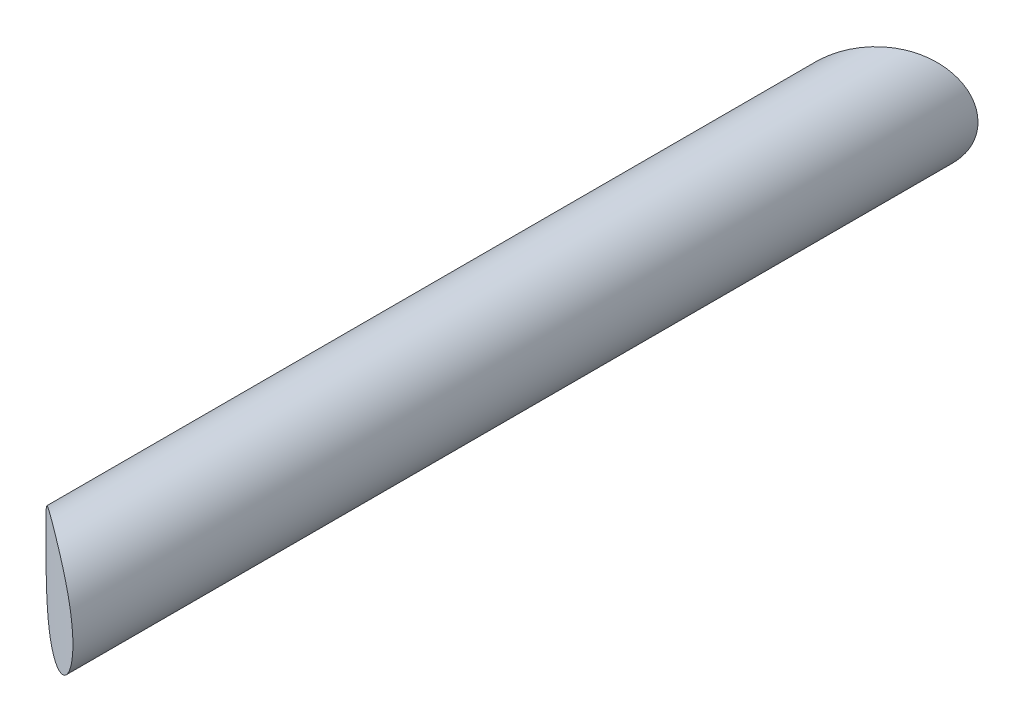
ISO-10303-21;
HEADER;
FILE_DESCRIPTION(('STEP AP214'),'2;1');
FILE_NAME('part.step','',(''),(''),'','','');
FILE_SCHEMA(('AUTOMOTIVE_DESIGN { 1 0 10303 214 1 1 1 1 }'));
ENDSEC;
DATA;
#1=APPLICATION_CONTEXT('core data for automotive mechanical design processes');
#2=APPLICATION_PROTOCOL_DEFINITION('international standard','automotive_design',2000,#1);
#3=PRODUCT_CONTEXT('',#1,'mechanical');
#4=PRODUCT('Part','Part','',(#3));
#5=PRODUCT_RELATED_PRODUCT_CATEGORY('part','',(#4));
#6=PRODUCT_DEFINITION_FORMATION('','',#4);
#7=PRODUCT_DEFINITION_CONTEXT('part definition',#1,'design');
#8=PRODUCT_DEFINITION('design','',#6,#7);
#9=PRODUCT_DEFINITION_SHAPE('','',#8);
#10=(LENGTH_UNIT() NAMED_UNIT(*) SI_UNIT(.MILLI.,.METRE.));
#11=(NAMED_UNIT(*) PLANE_ANGLE_UNIT() SI_UNIT($,.RADIAN.));
#12=(NAMED_UNIT(*) SI_UNIT($,.STERADIAN.) SOLID_ANGLE_UNIT());
#13=UNCERTAINTY_MEASURE_WITH_UNIT(LENGTH_MEASURE(1.E-05),#10,'distance_accuracy_value','');
#14=(GEOMETRIC_REPRESENTATION_CONTEXT(3) GLOBAL_UNCERTAINTY_ASSIGNED_CONTEXT((#13)) GLOBAL_UNIT_ASSIGNED_CONTEXT((#10,
#11,#12)) REPRESENTATION_CONTEXT('',''));
#15=CARTESIAN_POINT('',(0.,0.,0.));
#16=DIRECTION('',(0.,0.,1.));
#17=DIRECTION('',(1.,0.,0.));
#18=AXIS2_PLACEMENT_3D('',#15,#16,#17);
#19=CARTESIAN_POINT('',(0.,0.,-12.7));
#20=DIRECTION('',(0.,0.,1.));
#21=DIRECTION('',(1.,0.,0.));
#22=AXIS2_PLACEMENT_3D('',#19,#20,#21);
#23=CYLINDRICAL_SURFACE('',#22,1.35);
#24=CARTESIAN_POINT('',(1.35,0.,-11.0587056584394));
#25=CARTESIAN_POINT('',(1.35000202974968,0.0683117236619018,-11.0587065779387));
#26=CARTESIAN_POINT('',(1.34479351187721,0.136611916381151,-11.0557704538198));
#27=CARTESIAN_POINT('',(1.32423800582184,0.271151198424478,-11.0441250481397));
#28=CARTESIAN_POINT('',(1.30889193721564,0.337390474123632,-11.0354162902136));
#29=CARTESIAN_POINT('',(1.26887305416025,0.465807919673311,-11.0125248166408));
#30=CARTESIAN_POINT('',(1.2442201419215,0.527994425726224,-10.9983537804472));
#31=CARTESIAN_POINT('',(1.18671983462305,0.646965501902899,-10.9649520085586));
#32=CARTESIAN_POINT('',(1.15387103663791,0.703749144894012,-10.9457204065937));
#33=CARTESIAN_POINT('',(1.07981528175567,0.813041113820874,-10.9018118976244));
#34=CARTESIAN_POINT('',(1.03831785403161,0.865273929357036,-10.8769420083258));
#35=CARTESIAN_POINT('',(0.949478729441834,0.961927413155837,-10.822895498804));
#36=CARTESIAN_POINT('',(0.902135170596338,1.00634558149197,-10.7937175058774));
#37=CARTESIAN_POINT('',(0.797217839932821,1.09180999863554,-10.727994188568));
#38=CARTESIAN_POINT('',(0.73909711265127,1.13182587930861,-10.6909853381457));
#39=CARTESIAN_POINT('',(0.619315670367079,1.20156536931715,-10.6132237523081));
#40=CARTESIAN_POINT('',(0.557652999206522,1.23128322625432,-10.572468940456));
#41=CARTESIAN_POINT('',(0.422533231714895,1.28453596040605,-10.4813683292592));
#42=CARTESIAN_POINT('',(0.348744059015755,1.30636815783677,-10.4305211938372));
#43=CARTESIAN_POINT('',(0.200529493586344,1.33717086635505,-10.3259851026198));
#44=CARTESIAN_POINT('',(0.126103816070559,1.34613528074164,-10.2722948122326));
#45=CARTESIAN_POINT('',(-0.0341617961062906,1.35232686171306,-10.1539879776921));
#46=CARTESIAN_POINT('',(-0.119843219224185,1.34735596340079,-10.089038413138));
#47=CARTESIAN_POINT('',(-0.288120382624845,1.32164492162247,-9.95811818440156));
#48=CARTESIAN_POINT('',(-0.370711999892173,1.3008844445686,-9.89214631110862));
#49=CARTESIAN_POINT('',(-0.540314812679968,1.24079377524673,-9.75328154747184));
#50=CARTESIAN_POINT('',(-0.626737270590656,1.19959817122803,-9.68046788958517));
#51=CARTESIAN_POINT('',(-0.791043848241983,1.09820441500569,-9.53848573041724));
#52=CARTESIAN_POINT('',(-0.868939221487246,1.03803172497848,-9.4693124889473));
#53=CARTESIAN_POINT('',(-0.9892949327332,0.921060641752164,-9.36007827734508));
#54=CARTESIAN_POINT('',(-1.03501659403485,0.869585302258143,-9.31789074508389));
#55=CARTESIAN_POINT('',(-1.11955350970958,0.757629408845708,-9.23887725641851));
#56=CARTESIAN_POINT('',(-1.15838082356377,0.697164925977331,-9.20204195890079));
#57=CARTESIAN_POINT('',(-1.21973207950992,0.581439052975822,-9.14324667110279));
#58=CARTESIAN_POINT('',(-1.24396648462285,0.527852330382816,-9.11979112567716));
#59=CARTESIAN_POINT('',(-1.28573515339713,0.415868832822171,-9.07912435687196));
#60=CARTESIAN_POINT('',(-1.30327391728717,0.357475320762524,-9.06190893981449));
#61=CARTESIAN_POINT('',(-1.33055625841954,0.236611189042552,-9.03504095639409));
#62=CARTESIAN_POINT('',(-1.34023189508553,0.174109975172009,-9.02545432021547));
#63=CARTESIAN_POINT('',(-1.35064545768551,0.0476536076261703,-9.01513419147413));
#64=CARTESIAN_POINT('',(-1.35139020815257,-0.0163003984501001,-9.01439393895243));
#65=CARTESIAN_POINT('',(-1.34440461260654,-0.134564032412765,-9.02131962458989));
#66=CARTESIAN_POINT('',(-1.33780053679386,-0.189014029114349,-9.02786847772074));
#67=CARTESIAN_POINT('',(-1.31834230832775,-0.295656154426165,-9.04707934365985));
#68=CARTESIAN_POINT('',(-1.30548677186609,-0.347847780342071,-9.05974270995759));
#69=CARTESIAN_POINT('',(-1.27377523494469,-0.450532193950823,-9.09078780694729));
#70=CARTESIAN_POINT('',(-1.25474001304511,-0.500916813525263,-9.10933990935709));
#71=CARTESIAN_POINT('',(-1.21172222465393,-0.597520274019482,-9.15093366339153));
#72=CARTESIAN_POINT('',(-1.18773693743643,-0.643736803854421,-9.1739777835954));
#73=CARTESIAN_POINT('',(-1.12121720825725,-0.756095458595459,-9.23729536616992));
#74=CARTESIAN_POINT('',(-1.07576058528963,-0.819120720685797,-9.28004895010062));
#75=CARTESIAN_POINT('',(-0.977302562202648,-0.934427630317342,-9.37107331374112));
#76=CARTESIAN_POINT('',(-0.924282261136075,-0.986681536352163,-9.41935785338728));
#77=CARTESIAN_POINT('',(-0.796275732620925,-1.09421332853474,-9.53375629095417));
#78=CARTESIAN_POINT('',(-0.719366681746646,-1.14601018878245,-9.60099356151529));
#79=CARTESIAN_POINT('',(-0.558542836031548,-1.23242359559692,-9.73793878102672));
#80=CARTESIAN_POINT('',(-0.474625969414543,-1.26703504034752,-9.80764745708819));
#81=CARTESIAN_POINT('',(-0.300942495409437,-1.31917728912113,-9.9480142338071));
#82=CARTESIAN_POINT('',(-0.211126667258016,-1.3365375785827,-10.0186749486856));
#83=CARTESIAN_POINT('',(-0.028479432839006,-1.35280972420762,-10.158340249903));
#84=CARTESIAN_POINT('',(0.0643531481453871,-1.35171430572271,-10.2273441724549));
#85=CARTESIAN_POINT('',(0.253509828520963,-1.32951170322233,-10.3639974239162));
#86=CARTESIAN_POINT('',(0.349847500459695,-1.30774117132563,-10.4315256723982));
#87=CARTESIAN_POINT('',(0.538937266004975,-1.2417807105294,-10.5603328550335));
#88=CARTESIAN_POINT('',(0.631696729671833,-1.19763984000246,-10.6216251130946));
#89=CARTESIAN_POINT('',(0.781042363962177,-1.10348984983727,-10.717777924605));
#90=CARTESIAN_POINT('',(0.839956482080575,-1.05949739170587,-10.7549575056121));
#91=CARTESIAN_POINT('',(0.951412500569517,-0.960650420042957,-10.8241556376517));
#92=CARTESIAN_POINT('',(1.00395797076527,-0.905802037420443,-10.856177083323));
#93=CARTESIAN_POINT('',(1.10059756036541,-0.785601598132161,-10.9142634140535));
#94=CARTESIAN_POINT('',(1.14463316648362,-0.720182130266167,-10.9402872802089));
#95=CARTESIAN_POINT('',(1.22130186272802,-0.580721961495862,-10.9851289199883));
#96=CARTESIAN_POINT('',(1.25394188366599,-0.506686537494161,-11.0039510743748));
#97=CARTESIAN_POINT('',(1.30276523371941,-0.361260144970632,-11.0319317956116));
#98=CARTESIAN_POINT('',(1.32039165626157,-0.290516126715435,-11.0419421672441));
#99=CARTESIAN_POINT('',(1.34400484033384,-0.146509407994222,-11.055326832099));
#100=CARTESIAN_POINT('',(1.34999782357626,-0.0732480751689267,-11.0587046724951));
#101=CARTESIAN_POINT('',(1.35,0.,-11.0587056584394));
#102=B_SPLINE_CURVE_WITH_KNOTS('',3,(#24,#25,#26,#27,#28,#29,#30,#31,#32,#33,#34,#35,#36,#37,
#38,#39,#40,#41,#42,#43,#44,#45,#46,#47,#48,#49,#50,#51,#52,#53,#54,#55,#56,#57,#58,#59,#60,#61,
#62,#63,#64,#65,#66,#67,#68,#69,#70,#71,#72,#73,#74,#75,#76,#77,#78,#79,#80,#81,#82,#83,#84,#85,
#86,#87,#88,#89,#90,#91,#92,#93,#94,#95,#96,#97,#98,#99,#100,#101),.UNSPECIFIED.,.T.,.F.,(4,2,2,
2,2,2,2,2,2,2,2,2,2,2,2,2,2,2,2,2,2,2,2,2,2,2,2,2,2,2,2,2,2,2,2,2,2,2,4),(0.,0.204659266004824,
0.409299969926766,0.613505516494278,0.81774604182435,1.03046911706473,1.24326011973433,
1.48137483926558,1.71962235428058,1.99526607531328,2.27104035211233,2.59264297907349,
2.91466046390444,3.27381393033804,3.63248754439785,3.87395224268706,4.11499032239085,
4.30422420693859,4.49333068003656,4.68405423781118,4.87463204496114,5.03958076570503,
5.20456601573121,5.37484260680165,5.54521303818281,5.80981080436326,6.07508175163457,
6.4169247590656,6.75886918848416,7.10416082612479,7.44958856983991,7.80648736759169,
8.16260684789701,8.4088062415012,8.65486698812417,8.90256371900892,9.15010953685653,
9.36967537890848,9.58912376194934),.UNSPECIFIED.);
#103=CARTESIAN_POINT('',(1.35,0.,-11.0587056584394));
#104=VERTEX_POINT('',#103);
#105=EDGE_CURVE('E47',#104,#104,#102,.T.);
#106=ORIENTED_EDGE('',*,*,#105,.T.);
#107=EDGE_LOOP('',(#106));
#108=FACE_BOUND('',#107,.T.);
#109=CARTESIAN_POINT('',(1.35,0.,11.0587056584394));
#110=CARTESIAN_POINT('',(1.35000202974968,-0.0683117236619018,11.0587065779387));
#111=CARTESIAN_POINT('',(1.34479351187721,-0.136611916381151,11.0557704538198));
#112=CARTESIAN_POINT('',(1.32423800582184,-0.271151198424478,11.0441250481397));
#113=CARTESIAN_POINT('',(1.30889193721564,-0.337390474123632,11.0354162902136));
#114=CARTESIAN_POINT('',(1.26887305416025,-0.465807919673311,11.0125248166408));
#115=CARTESIAN_POINT('',(1.2442201419215,-0.527994425726225,10.9983537804472));
#116=CARTESIAN_POINT('',(1.18671983462305,-0.6469655019029,10.9649520085586));
#117=CARTESIAN_POINT('',(1.15387103663791,-0.703749144894012,10.9457204065937));
#118=CARTESIAN_POINT('',(1.07981528175567,-0.813041113820874,10.9018118976244));
#119=CARTESIAN_POINT('',(1.03831785403161,-0.865273929357037,10.8769420083258));
#120=CARTESIAN_POINT('',(0.949478729441834,-0.961927413155837,10.822895498804));
#121=CARTESIAN_POINT('',(0.902135170596338,-1.00634558149197,10.7937175058774));
#122=CARTESIAN_POINT('',(0.797217839932821,-1.09180999863554,10.727994188568));
#123=CARTESIAN_POINT('',(0.73909711265127,-1.13182587930861,10.6909853381457));
#124=CARTESIAN_POINT('',(0.619315670367079,-1.20156536931715,10.6132237523081));
#125=CARTESIAN_POINT('',(0.557652999206522,-1.23128322625432,10.572468940456));
#126=CARTESIAN_POINT('',(0.422533231714895,-1.28453596040605,10.4813683292592));
#127=CARTESIAN_POINT('',(0.348744059015755,-1.30636815783677,10.4305211938372));
#128=CARTESIAN_POINT('',(0.200529493586344,-1.33717086635505,10.3259851026198));
#129=CARTESIAN_POINT('',(0.12610381607056,-1.34613528074164,10.2722948122326));
#130=CARTESIAN_POINT('',(-0.0341617961062903,-1.35232686171306,10.1539879776921));
#131=CARTESIAN_POINT('',(-0.119843219224186,-1.3473559634008,10.089038413138));
#132=CARTESIAN_POINT('',(-0.288120382624847,-1.32164492162247,9.95811818440155));
#133=CARTESIAN_POINT('',(-0.370711999892174,-1.3008844445686,9.89214631110861));
#134=CARTESIAN_POINT('',(-0.54031481267997,-1.24079377524673,9.75328154747183));
#135=CARTESIAN_POINT('',(-0.626737270590658,-1.19959817122803,9.68046788958516));
#136=CARTESIAN_POINT('',(-0.791043848241984,-1.09820441500569,9.53848573041724));
#137=CARTESIAN_POINT('',(-0.868939221487246,-1.03803172497848,9.46931248894729));
#138=CARTESIAN_POINT('',(-0.989294932733199,-0.921060641752164,9.36007827734508));
#139=CARTESIAN_POINT('',(-1.03501659403485,-0.869585302258144,9.31789074508389));
#140=CARTESIAN_POINT('',(-1.11955350970958,-0.757629408845707,9.23887725641851));
#141=CARTESIAN_POINT('',(-1.15838082356377,-0.69716492597733,9.20204195890079));
#142=CARTESIAN_POINT('',(-1.21973207950992,-0.581439052975822,9.14324667110279));
#143=CARTESIAN_POINT('',(-1.24396648462285,-0.527852330382816,9.11979112567716));
#144=CARTESIAN_POINT('',(-1.28573515339713,-0.415868832822171,9.07912435687196));
#145=CARTESIAN_POINT('',(-1.30327391728717,-0.357475320762523,9.06190893981449));
#146=CARTESIAN_POINT('',(-1.33055625841954,-0.236611189042551,9.0350409563941));
#147=CARTESIAN_POINT('',(-1.34023189508553,-0.174109975172007,9.02545432021547));
#148=CARTESIAN_POINT('',(-1.35064545768551,-0.0476536076261682,9.01513419147413));
#149=CARTESIAN_POINT('',(-1.35139020815257,0.0163003984501021,9.01439393895243));
#150=CARTESIAN_POINT('',(-1.34440461260654,0.134564032412767,9.02131962458989));
#151=CARTESIAN_POINT('',(-1.33780053679386,0.189014029114351,9.02786847772074));
#152=CARTESIAN_POINT('',(-1.31834230832775,0.295656154426167,9.04707934365985));
#153=CARTESIAN_POINT('',(-1.30548677186609,0.347847780342073,9.05974270995759));
#154=CARTESIAN_POINT('',(-1.27377523494469,0.450532193950824,9.09078780694729));
#155=CARTESIAN_POINT('',(-1.25474001304511,0.500916813525264,9.10933990935709));
#156=CARTESIAN_POINT('',(-1.21172222465393,0.597520274019483,9.15093366339153));
#157=CARTESIAN_POINT('',(-1.18773693743643,0.643736803854423,9.1739777835954));
#158=CARTESIAN_POINT('',(-1.12121720825725,0.756095458595461,9.23729536616992));
#159=CARTESIAN_POINT('',(-1.07576058528963,0.819120720685799,9.28004895010063));
#160=CARTESIAN_POINT('',(-0.977302562202646,0.934427630317345,9.37107331374112));
#161=CARTESIAN_POINT('',(-0.924282261136073,0.986681536352166,9.41935785338728));
#162=CARTESIAN_POINT('',(-0.796275732620922,1.09421332853474,9.53375629095417));
#163=CARTESIAN_POINT('',(-0.719366681746643,1.14601018878245,9.6009935615153));
#164=CARTESIAN_POINT('',(-0.558542836031545,1.23242359559693,9.73793878102672));
#165=CARTESIAN_POINT('',(-0.47462596941454,1.26703504034752,9.80764745708819));
#166=CARTESIAN_POINT('',(-0.300942495409434,1.31917728912113,9.94801423380711));
#167=CARTESIAN_POINT('',(-0.211126667258013,1.3365375785827,10.0186749486856));
#168=CARTESIAN_POINT('',(-0.0284794328390029,1.35280972420762,10.158340249903));
#169=CARTESIAN_POINT('',(0.0643531481453905,1.35171430572271,10.2273441724549));
#170=CARTESIAN_POINT('',(0.253509828520966,1.32951170322233,10.3639974239162));
#171=CARTESIAN_POINT('',(0.349847500459697,1.30774117132563,10.4315256723982));
#172=CARTESIAN_POINT('',(0.538937266004977,1.2417807105294,10.5603328550336));
#173=CARTESIAN_POINT('',(0.631696729671836,1.19763984000246,10.6216251130946));
#174=CARTESIAN_POINT('',(0.781042363962179,1.10348984983727,10.717777924605));
#175=CARTESIAN_POINT('',(0.839956482080578,1.05949739170586,10.7549575056121));
#176=CARTESIAN_POINT('',(0.951412500569519,0.960650420042954,10.8241556376517));
#177=CARTESIAN_POINT('',(1.00395797076528,0.90580203742044,10.856177083323));
#178=CARTESIAN_POINT('',(1.10059756036541,0.785601598132159,10.9142634140535));
#179=CARTESIAN_POINT('',(1.14463316648362,0.720182130266165,10.9402872802089));
#180=CARTESIAN_POINT('',(1.22130186272803,0.58072196149586,10.9851289199883));
#181=CARTESIAN_POINT('',(1.25394188366599,0.506686537494158,11.0039510743748));
#182=CARTESIAN_POINT('',(1.30276523371941,0.36126014497063,11.0319317956116));
#183=CARTESIAN_POINT('',(1.32039165626157,0.290516126715433,11.0419421672441));
#184=CARTESIAN_POINT('',(1.34400484033385,0.146509407994221,11.055326832099));
#185=CARTESIAN_POINT('',(1.34999782357626,0.073248075168926,11.0587046724951));
#186=CARTESIAN_POINT('',(1.35,0.,11.0587056584394));
#187=B_SPLINE_CURVE_WITH_KNOTS('',3,(#109,#110,#111,#112,#113,#114,#115,#116,#117,#118,#119,
#120,#121,#122,#123,#124,#125,#126,#127,#128,#129,#130,#131,#132,#133,#134,#135,#136,#137,#138,
#139,#140,#141,#142,#143,#144,#145,#146,#147,#148,#149,#150,#151,#152,#153,#154,#155,#156,#157,
#158,#159,#160,#161,#162,#163,#164,#165,#166,#167,#168,#169,#170,#171,#172,#173,#174,#175,#176,
#177,#178,#179,#180,#181,#182,#183,#184,#185,#186),.UNSPECIFIED.,.T.,.F.,(4,2,2,2,2,2,2,2,2,2,2,
2,2,2,2,2,2,2,2,2,2,2,2,2,2,2,2,2,2,2,2,2,2,2,2,2,2,2,4),(0.,0.204659266004824,
0.409299969926767,0.613505516494279,0.817746041824351,1.03046911706473,1.24326011973434,
1.48137483926558,1.71962235428058,1.99526607531328,2.27104035211233,2.59264297907349,
2.91466046390444,3.27381393033805,3.63248754439785,3.87395224268706,4.11499032239085,
4.30422420693859,4.49333068003657,4.68405423781119,4.87463204496114,5.03958076570504,
5.20456601573121,5.37484260680165,5.54521303818281,5.80981080436326,6.07508175163458,
6.4169247590656,6.75886918848417,7.10416082612479,7.44958856983992,7.8064873675917,
8.16260684789701,8.4088062415012,8.65486698812417,8.90256371900892,9.15010953685653,
9.36967537890848,9.58912376194934),.UNSPECIFIED.);
#188=CARTESIAN_POINT('',(1.35,0.,11.0587056584394));
#189=VERTEX_POINT('',#188);
#190=EDGE_CURVE('E10',#189,#189,#187,.T.);
#191=ORIENTED_EDGE('',*,*,#190,.T.);
#192=EDGE_LOOP('',(#191));
#193=FACE_BOUND('',#192,.T.);
#194=ADVANCED_FACE('F37',(#108,#193),#23,.T.);
#195=CARTESIAN_POINT('',(7.5946,-1.35,0.));
#196=DIRECTION('',(0.,1.,0.));
#197=DIRECTION('',(0.,0.,1.));
#198=AXIS2_PLACEMENT_3D('',#195,#196,#197);
#199=CYLINDRICAL_SURFACE('',#198,12.7);
#200=ORIENTED_EDGE('',*,*,#190,.F.);
#201=EDGE_LOOP('',(#200));
#202=FACE_BOUND('',#201,.T.);
#203=ADVANCED_FACE('F56',(#202),#199,.T.);
#204=ORIENTED_EDGE('',*,*,#105,.F.);
#205=EDGE_LOOP('',(#204));
#206=FACE_BOUND('',#205,.T.);
#207=ADVANCED_FACE('F59',(#206),#199,.T.);
#208=CLOSED_SHELL('',(#194,#203,#207));
#209=MANIFOLD_SOLID_BREP('B2',#208);
#210=ADVANCED_BREP_SHAPE_REPRESENTATION('',(#18,#209),#14);
#211=SHAPE_DEFINITION_REPRESENTATION(#9,#210);
ENDSEC;
END-ISO-10303-21;
